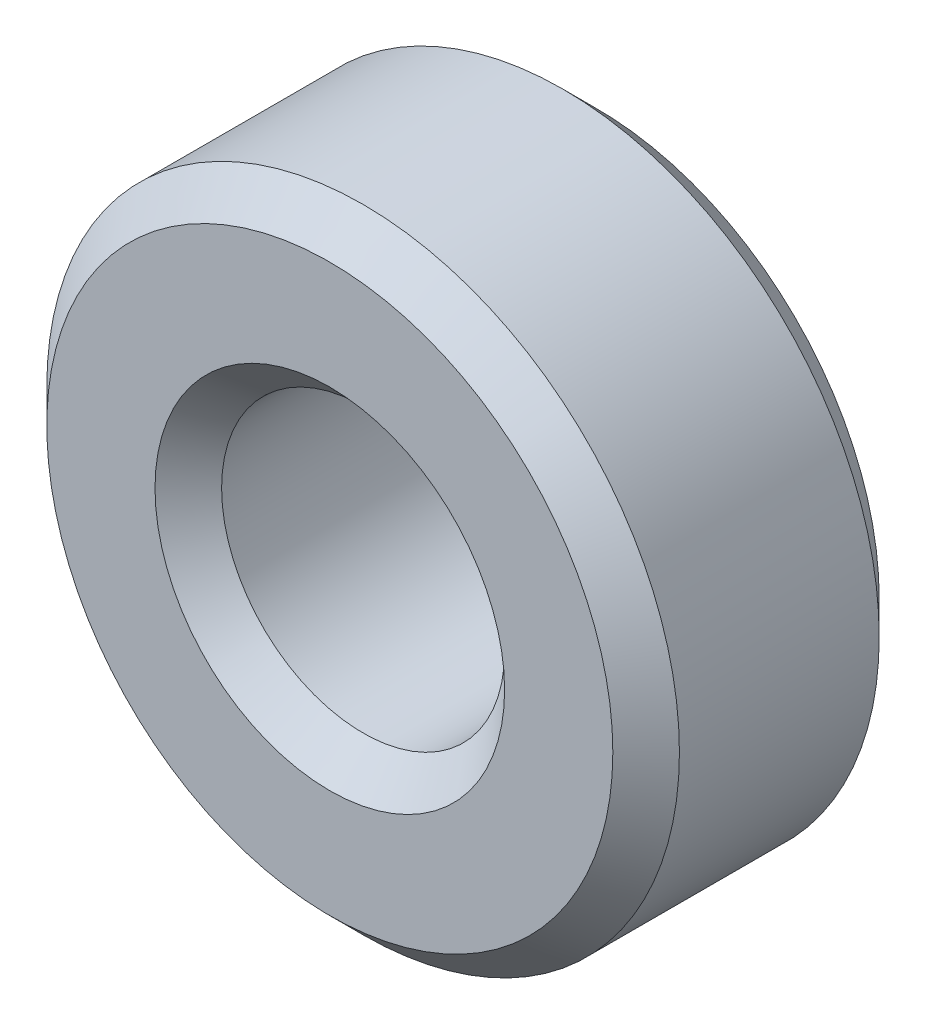
ISO-10303-21;
HEADER;
FILE_DESCRIPTION(('STEP AP214'),'2;1');
FILE_NAME('part.step','',(''),(''),'','','');
FILE_SCHEMA(('AUTOMOTIVE_DESIGN { 1 0 10303 214 1 1 1 1 }'));
ENDSEC;
DATA;
#1=APPLICATION_CONTEXT('core data for automotive mechanical design processes');
#2=APPLICATION_PROTOCOL_DEFINITION('international standard','automotive_design',2000,#1);
#3=PRODUCT_CONTEXT('',#1,'mechanical');
#4=PRODUCT('Part','Part','',(#3));
#5=PRODUCT_RELATED_PRODUCT_CATEGORY('part','',(#4));
#6=PRODUCT_DEFINITION_FORMATION('','',#4);
#7=PRODUCT_DEFINITION_CONTEXT('part definition',#1,'design');
#8=PRODUCT_DEFINITION('design','',#6,#7);
#9=PRODUCT_DEFINITION_SHAPE('','',#8);
#10=(LENGTH_UNIT() NAMED_UNIT(*) SI_UNIT(.MILLI.,.METRE.));
#11=(NAMED_UNIT(*) PLANE_ANGLE_UNIT() SI_UNIT($,.RADIAN.));
#12=(NAMED_UNIT(*) SI_UNIT($,.STERADIAN.) SOLID_ANGLE_UNIT());
#13=UNCERTAINTY_MEASURE_WITH_UNIT(LENGTH_MEASURE(1.E-05),#10,'distance_accuracy_value','');
#14=(GEOMETRIC_REPRESENTATION_CONTEXT(3) GLOBAL_UNCERTAINTY_ASSIGNED_CONTEXT((#13)) GLOBAL_UNIT_ASSIGNED_CONTEXT((#10,
#11,#12)) REPRESENTATION_CONTEXT('',''));
#15=CARTESIAN_POINT('',(0.,0.,0.));
#16=DIRECTION('',(0.,0.,1.));
#17=DIRECTION('',(1.,0.,0.));
#18=AXIS2_PLACEMENT_3D('',#15,#16,#17);
#19=CARTESIAN_POINT('',(0.,0.,0.));
#20=DIRECTION('',(0.,0.,-1.));
#21=DIRECTION('',(1.,0.,0.));
#22=AXIS2_PLACEMENT_3D('',#19,#20,#21);
#23=CYLINDRICAL_SURFACE('',#22,4.25);
#24=DIRECTION('',(0.,0.,1.));
#25=VECTOR('',#24,1.);
#26=CARTESIAN_POINT('',(4.25,0.,0.));
#27=LINE('',#26,#25);
#28=CARTESIAN_POINT('',(4.25,0.,1.));
#29=VERTEX_POINT('',#28);
#30=CARTESIAN_POINT('',(4.25,0.,7.));
#31=VERTEX_POINT('',#30);
#32=EDGE_CURVE('E10',#29,#31,#27,.T.);
#33=ORIENTED_EDGE('',*,*,#32,.F.);
#34=CARTESIAN_POINT('',(0.,0.,1.));
#35=DIRECTION('',(0.,0.,1.));
#36=DIRECTION('',(1.,0.,0.));
#37=AXIS2_PLACEMENT_3D('',#34,#35,#36);
#38=CIRCLE('',#37,4.25);
#39=EDGE_CURVE('E86',#29,#29,#38,.T.);
#40=ORIENTED_EDGE('',*,*,#39,.F.);
#41=ORIENTED_EDGE('',*,*,#32,.T.);
#42=CARTESIAN_POINT('',(0.,0.,7.));
#43=DIRECTION('',(0.,0.,-1.));
#44=DIRECTION('',(1.,0.,0.));
#45=AXIS2_PLACEMENT_3D('',#42,#43,#44);
#46=CIRCLE('',#45,4.25);
#47=EDGE_CURVE('E90',#31,#31,#46,.T.);
#48=ORIENTED_EDGE('',*,*,#47,.F.);
#49=EDGE_LOOP('',(#33,#40,#41,#48));
#50=FACE_BOUND('',#49,.T.);
#51=ADVANCED_FACE('F16',(#50),#23,.F.);
#52=CARTESIAN_POINT('',(0.,0.,7.));
#53=DIRECTION('',(0.,0.,1.));
#54=DIRECTION('',(1.,0.,0.));
#55=AXIS2_PLACEMENT_3D('',#52,#53,#54);
#56=CONICAL_SURFACE('',#55,4.25,0.785398163397);
#57=ORIENTED_EDGE('',*,*,#47,.T.);
#58=DIRECTION('',(-0.707106781186548,0.,-0.707106781186548));
#59=VECTOR('',#58,1.);
#60=CARTESIAN_POINT('',(4.25,0.,7.));
#61=LINE('',#60,#59);
#62=CARTESIAN_POINT('',(5.25,0.,8.));
#63=VERTEX_POINT('',#62);
#64=EDGE_CURVE('E20',#63,#31,#61,.T.);
#65=ORIENTED_EDGE('',*,*,#64,.F.);
#66=CARTESIAN_POINT('',(0.,0.,8.));
#67=DIRECTION('',(0.,0.,-1.));
#68=DIRECTION('',(1.,0.,0.));
#69=AXIS2_PLACEMENT_3D('',#66,#67,#68);
#70=CIRCLE('',#69,5.25);
#71=EDGE_CURVE('E80',#63,#63,#70,.T.);
#72=ORIENTED_EDGE('',*,*,#71,.F.);
#73=ORIENTED_EDGE('',*,*,#64,.T.);
#74=EDGE_LOOP('',(#57,#65,#72,#73));
#75=FACE_BOUND('',#74,.T.);
#76=ADVANCED_FACE('F18',(#75),#56,.F.);
#77=CARTESIAN_POINT('',(0.,0.,1.));
#78=DIRECTION('',(0.,0.,-1.));
#79=DIRECTION('',(1.,0.,0.));
#80=AXIS2_PLACEMENT_3D('',#77,#78,#79);
#81=CONICAL_SURFACE('',#80,4.25,0.785398163397);
#82=ORIENTED_EDGE('',*,*,#39,.T.);
#83=DIRECTION('',(-0.707106781186548,0.,0.707106781186548));
#84=VECTOR('',#83,1.);
#85=CARTESIAN_POINT('',(4.25,0.,1.));
#86=LINE('',#85,#84);
#87=CARTESIAN_POINT('',(5.25,0.,0.));
#88=VERTEX_POINT('',#87);
#89=EDGE_CURVE('E88',#88,#29,#86,.T.);
#90=ORIENTED_EDGE('',*,*,#89,.F.);
#91=CARTESIAN_POINT('',(0.,0.,0.));
#92=DIRECTION('',(0.,0.,1.));
#93=DIRECTION('',(1.,0.,0.));
#94=AXIS2_PLACEMENT_3D('',#91,#92,#93);
#95=CIRCLE('',#94,5.25);
#96=EDGE_CURVE('E73',#88,#88,#95,.T.);
#97=ORIENTED_EDGE('',*,*,#96,.F.);
#98=ORIENTED_EDGE('',*,*,#89,.T.);
#99=EDGE_LOOP('',(#82,#90,#97,#98));
#100=FACE_BOUND('',#99,.T.);
#101=ADVANCED_FACE('F137',(#100),#81,.F.);
#102=CARTESIAN_POINT('',(0.,0.,8.));
#103=DIRECTION('',(0.,0.,1.));
#104=DIRECTION('',(1.,0.,0.));
#105=AXIS2_PLACEMENT_3D('',#102,#103,#104);
#106=PLANE('',#105);
#107=ORIENTED_EDGE('',*,*,#71,.T.);
#108=EDGE_LOOP('',(#107));
#109=FACE_BOUND('',#108,.T.);
#110=CARTESIAN_POINT('',(0.,0.,8.));
#111=DIRECTION('',(0.,0.,1.));
#112=DIRECTION('',(1.,0.,0.));
#113=AXIS2_PLACEMENT_3D('',#110,#111,#112);
#114=CIRCLE('',#113,8.5);
#115=CARTESIAN_POINT('',(8.5,0.,8.));
#116=VERTEX_POINT('',#115);
#117=EDGE_CURVE('E68',#116,#116,#114,.T.);
#118=ORIENTED_EDGE('',*,*,#117,.T.);
#119=EDGE_LOOP('',(#118));
#120=FACE_BOUND('',#119,.T.);
#121=ADVANCED_FACE('F69',(#109,#120),#106,.T.);
#122=CARTESIAN_POINT('',(0.,0.,0.));
#123=DIRECTION('',(0.,0.,1.));
#124=DIRECTION('',(1.,0.,0.));
#125=AXIS2_PLACEMENT_3D('',#122,#123,#124);
#126=PLANE('',#125);
#127=ORIENTED_EDGE('',*,*,#96,.T.);
#128=EDGE_LOOP('',(#127));
#129=FACE_BOUND('',#128,.T.);
#130=CARTESIAN_POINT('',(0.,0.,0.));
#131=DIRECTION('',(0.,0.,1.));
#132=DIRECTION('',(1.,0.,0.));
#133=AXIS2_PLACEMENT_3D('',#130,#131,#132);
#134=CIRCLE('',#133,8.5);
#135=CARTESIAN_POINT('',(8.5,0.,0.));
#136=VERTEX_POINT('',#135);
#137=EDGE_CURVE('E112',#136,#136,#134,.T.);
#138=ORIENTED_EDGE('',*,*,#137,.F.);
#139=EDGE_LOOP('',(#138));
#140=FACE_BOUND('',#139,.T.);
#141=ADVANCED_FACE('F126',(#129,#140),#126,.F.);
#142=CARTESIAN_POINT('',(0.,0.,7.));
#143=DIRECTION('',(0.,0.,-1.));
#144=DIRECTION('',(1.,0.,0.));
#145=AXIS2_PLACEMENT_3D('',#142,#143,#144);
#146=CONICAL_SURFACE('',#145,9.5,0.785398163397);
#147=DIRECTION('',(-0.707106781186548,0.,0.707106781186548));
#148=VECTOR('',#147,1.);
#149=CARTESIAN_POINT('',(9.5,0.,7.));
#150=LINE('',#149,#148);
#151=CARTESIAN_POINT('',(9.5,0.,7.));
#152=VERTEX_POINT('',#151);
#153=EDGE_CURVE('E74',#152,#116,#150,.T.);
#154=ORIENTED_EDGE('',*,*,#153,.F.);
#155=CARTESIAN_POINT('',(0.,0.,7.));
#156=DIRECTION('',(0.,0.,1.));
#157=DIRECTION('',(1.,0.,0.));
#158=AXIS2_PLACEMENT_3D('',#155,#156,#157);
#159=CIRCLE('',#158,9.5);
#160=EDGE_CURVE('E113',#152,#152,#159,.T.);
#161=ORIENTED_EDGE('',*,*,#160,.T.);
#162=ORIENTED_EDGE('',*,*,#153,.T.);
#163=ORIENTED_EDGE('',*,*,#117,.F.);
#164=EDGE_LOOP('',(#154,#161,#162,#163));
#165=FACE_BOUND('',#164,.T.);
#166=ADVANCED_FACE('F128',(#165),#146,.T.);
#167=CARTESIAN_POINT('',(0.,0.,1.));
#168=DIRECTION('',(0.,0.,1.));
#169=DIRECTION('',(1.,0.,0.));
#170=AXIS2_PLACEMENT_3D('',#167,#168,#169);
#171=CONICAL_SURFACE('',#170,9.5,0.785398163397);
#172=ORIENTED_EDGE('',*,*,#137,.T.);
#173=DIRECTION('',(-0.707106781186548,0.,-0.707106781186548));
#174=VECTOR('',#173,1.);
#175=CARTESIAN_POINT('',(9.5,0.,1.));
#176=LINE('',#175,#174);
#177=CARTESIAN_POINT('',(9.5,0.,1.));
#178=VERTEX_POINT('',#177);
#179=EDGE_CURVE('E83',#178,#136,#176,.T.);
#180=ORIENTED_EDGE('',*,*,#179,.F.);
#181=CARTESIAN_POINT('',(0.,0.,1.));
#182=DIRECTION('',(0.,0.,1.));
#183=DIRECTION('',(1.,0.,0.));
#184=AXIS2_PLACEMENT_3D('',#181,#182,#183);
#185=CIRCLE('',#184,9.5);
#186=EDGE_CURVE('E109',#178,#178,#185,.T.);
#187=ORIENTED_EDGE('',*,*,#186,.F.);
#188=ORIENTED_EDGE('',*,*,#179,.T.);
#189=EDGE_LOOP('',(#172,#180,#187,#188));
#190=FACE_BOUND('',#189,.T.);
#191=ADVANCED_FACE('F122',(#190),#171,.T.);
#192=CARTESIAN_POINT('',(0.,0.,0.));
#193=DIRECTION('',(0.,0.,1.));
#194=DIRECTION('',(1.,0.,0.));
#195=AXIS2_PLACEMENT_3D('',#192,#193,#194);
#196=CYLINDRICAL_SURFACE('',#195,9.5);
#197=DIRECTION('',(0.,0.,1.));
#198=VECTOR('',#197,1.);
#199=CARTESIAN_POINT('',(9.5,0.,0.));
#200=LINE('',#199,#198);
#201=EDGE_CURVE('E163',#178,#152,#200,.T.);
#202=ORIENTED_EDGE('',*,*,#201,.F.);
#203=ORIENTED_EDGE('',*,*,#186,.T.);
#204=ORIENTED_EDGE('',*,*,#201,.T.);
#205=ORIENTED_EDGE('',*,*,#160,.F.);
#206=EDGE_LOOP('',(#202,#203,#204,#205));
#207=FACE_BOUND('',#206,.T.);
#208=ADVANCED_FACE('F152',(#207),#196,.T.);
#209=CLOSED_SHELL('',(#51,#76,#101,#121,#141,#166,#191,#208));
#210=MANIFOLD_SOLID_BREP('B1',#209);
#211=ADVANCED_BREP_SHAPE_REPRESENTATION('',(#18,#210),#14);
#212=SHAPE_DEFINITION_REPRESENTATION(#9,#211);
ENDSEC;
END-ISO-10303-21;
